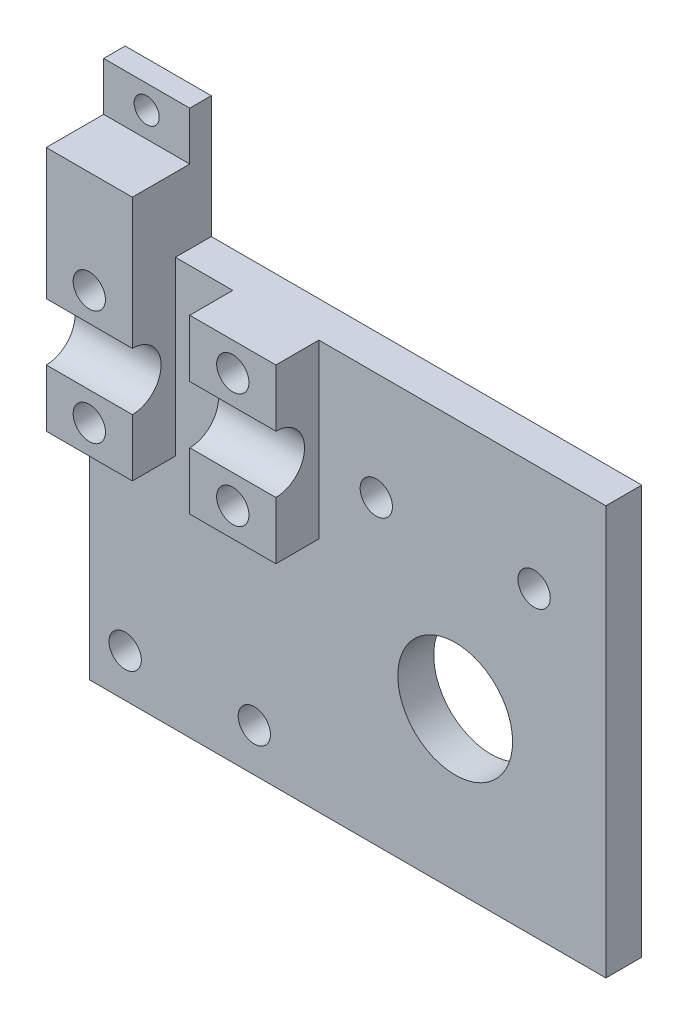
ISO-10303-21;
HEADER;
FILE_DESCRIPTION(('STEP AP214'),'2;1');
FILE_NAME('part.step','',(''),(''),'','','');
FILE_SCHEMA(('AUTOMOTIVE_DESIGN { 1 0 10303 214 1 1 1 1 }'));
ENDSEC;
DATA;
#1=APPLICATION_CONTEXT('core data for automotive mechanical design processes');
#2=APPLICATION_PROTOCOL_DEFINITION('international standard','automotive_design',2000,#1);
#3=PRODUCT_CONTEXT('',#1,'mechanical');
#4=PRODUCT('Part','Part','',(#3));
#5=PRODUCT_RELATED_PRODUCT_CATEGORY('part','',(#4));
#6=PRODUCT_DEFINITION_FORMATION('','',#4);
#7=PRODUCT_DEFINITION_CONTEXT('part definition',#1,'design');
#8=PRODUCT_DEFINITION('design','',#6,#7);
#9=PRODUCT_DEFINITION_SHAPE('','',#8);
#10=(LENGTH_UNIT() NAMED_UNIT(*) SI_UNIT(.MILLI.,.METRE.));
#11=(NAMED_UNIT(*) PLANE_ANGLE_UNIT() SI_UNIT($,.RADIAN.));
#12=(NAMED_UNIT(*) SI_UNIT($,.STERADIAN.) SOLID_ANGLE_UNIT());
#13=UNCERTAINTY_MEASURE_WITH_UNIT(LENGTH_MEASURE(1.E-05),#10,'distance_accuracy_value','');
#14=(GEOMETRIC_REPRESENTATION_CONTEXT(3) GLOBAL_UNCERTAINTY_ASSIGNED_CONTEXT((#13)) GLOBAL_UNIT_ASSIGNED_CONTEXT((#10,
#11,#12)) REPRESENTATION_CONTEXT('',''));
#15=CARTESIAN_POINT('',(0.,0.,0.));
#16=DIRECTION('',(0.,0.,1.));
#17=DIRECTION('',(1.,0.,0.));
#18=AXIS2_PLACEMENT_3D('',#15,#16,#17);
#19=CARTESIAN_POINT('',(-16.,28.5,5.));
#20=DIRECTION('',(0.,-1.,0.));
#21=DIRECTION('',(1.,0.,0.));
#22=AXIS2_PLACEMENT_3D('',#19,#20,#21);
#23=PLANE('',#22);
#24=DIRECTION('',(0.,0.,-1.));
#25=VECTOR('',#24,1.);
#26=CARTESIAN_POINT('',(-4.,28.5,3.));
#27=LINE('',#26,#25);
#28=CARTESIAN_POINT('',(-4.,28.5,5.));
#29=VERTEX_POINT('',#28);
#30=CARTESIAN_POINT('',(-4.,28.5,0.));
#31=VERTEX_POINT('',#30);
#32=EDGE_CURVE('E204',#29,#31,#27,.T.);
#33=ORIENTED_EDGE('',*,*,#32,.F.);
#34=DIRECTION('',(-1.,0.,0.));
#35=VECTOR('',#34,1.);
#36=CARTESIAN_POINT('',(-16.,28.5,5.));
#37=LINE('',#36,#35);
#38=CARTESIAN_POINT('',(4.,28.5,5.));
#39=VERTEX_POINT('',#38);
#40=EDGE_CURVE('E335',#39,#29,#37,.T.);
#41=ORIENTED_EDGE('',*,*,#40,.F.);
#42=DIRECTION('',(0.,0.,1.));
#43=VECTOR('',#42,1.);
#44=CARTESIAN_POINT('',(4.,28.5,5.));
#45=LINE('',#44,#43);
#46=CARTESIAN_POINT('',(4.,28.5,11.));
#47=VERTEX_POINT('',#46);
#48=EDGE_CURVE('E265',#39,#47,#45,.T.);
#49=ORIENTED_EDGE('',*,*,#48,.T.);
#50=DIRECTION('',(1.,0.,0.));
#51=VECTOR('',#50,1.);
#52=CARTESIAN_POINT('',(4.,28.5,11.));
#53=LINE('',#52,#51);
#54=CARTESIAN_POINT('',(16.,28.5,11.));
#55=VERTEX_POINT('',#54);
#56=EDGE_CURVE('E268',#47,#55,#53,.T.);
#57=ORIENTED_EDGE('',*,*,#56,.T.);
#58=DIRECTION('',(0.,0.,1.));
#59=VECTOR('',#58,1.);
#60=CARTESIAN_POINT('',(16.,28.5,5.));
#61=LINE('',#60,#59);
#62=CARTESIAN_POINT('',(16.,28.5,5.));
#63=VERTEX_POINT('',#62);
#64=EDGE_CURVE('E253',#63,#55,#61,.T.);
#65=ORIENTED_EDGE('',*,*,#64,.F.);
#66=CARTESIAN_POINT('',(56.,28.5,5.));
#67=VERTEX_POINT('',#66);
#68=EDGE_CURVE('E326',#67,#63,#37,.T.);
#69=ORIENTED_EDGE('',*,*,#68,.F.);
#70=DIRECTION('',(0.,0.,-1.));
#71=VECTOR('',#70,1.);
#72=CARTESIAN_POINT('',(56.,28.5,5.));
#73=LINE('',#72,#71);
#74=CARTESIAN_POINT('',(56.,28.5,0.));
#75=VERTEX_POINT('',#74);
#76=EDGE_CURVE('E354',#67,#75,#73,.T.);
#77=ORIENTED_EDGE('',*,*,#76,.T.);
#78=DIRECTION('',(-1.,0.,0.));
#79=VECTOR('',#78,1.);
#80=CARTESIAN_POINT('',(-16.,28.5,0.));
#81=LINE('',#80,#79);
#82=EDGE_CURVE('E339',#75,#31,#81,.T.);
#83=ORIENTED_EDGE('',*,*,#82,.T.);
#84=EDGE_LOOP('',(#33,#41,#49,#57,#65,#69,#77,#83));
#85=FACE_BOUND('',#84,.T.);
#86=ADVANCED_FACE('F32',(#85),#23,.F.);
#87=CARTESIAN_POINT('',(0.,0.,3.));
#88=DIRECTION('',(0.,0.,1.));
#89=DIRECTION('',(1.,0.,0.));
#90=AXIS2_PLACEMENT_3D('',#87,#88,#89);
#91=PLANE('',#90);
#92=CARTESIAN_POINT('',(-10.,42.25,3.));
#93=DIRECTION('',(0.,0.,-1.));
#94=DIRECTION('',(-1.,0.,0.));
#95=AXIS2_PLACEMENT_3D('',#92,#93,#94);
#96=CIRCLE('',#95,1.75);
#97=CARTESIAN_POINT('',(-11.75,42.25,3.));
#98=VERTEX_POINT('',#97);
#99=EDGE_CURVE('E187',#98,#98,#96,.T.);
#100=ORIENTED_EDGE('',*,*,#99,.T.);
#101=EDGE_LOOP('',(#100));
#102=FACE_BOUND('',#101,.T.);
#103=DIRECTION('',(0.,1.,0.));
#104=VECTOR('',#103,1.);
#105=CARTESIAN_POINT('',(-16.,39.,3.));
#106=LINE('',#105,#104);
#107=CARTESIAN_POINT('',(-16.,38.75,3.));
#108=VERTEX_POINT('',#107);
#109=CARTESIAN_POINT('',(-16.,45.5,3.));
#110=VERTEX_POINT('',#109);
#111=EDGE_CURVE('E36',#108,#110,#106,.T.);
#112=ORIENTED_EDGE('',*,*,#111,.F.);
#113=DIRECTION('',(-1.,0.,0.));
#114=VECTOR('',#113,1.);
#115=CARTESIAN_POINT('',(-16.,38.75,3.));
#116=LINE('',#115,#114);
#117=CARTESIAN_POINT('',(-4.,38.75,3.));
#118=VERTEX_POINT('',#117);
#119=EDGE_CURVE('E182',#118,#108,#116,.T.);
#120=ORIENTED_EDGE('',*,*,#119,.F.);
#121=DIRECTION('',(0.,-1.,0.));
#122=VECTOR('',#121,1.);
#123=CARTESIAN_POINT('',(-4.,39.,3.));
#124=LINE('',#123,#122);
#125=CARTESIAN_POINT('',(-4.,45.5,3.));
#126=VERTEX_POINT('',#125);
#127=EDGE_CURVE('E176',#126,#118,#124,.T.);
#128=ORIENTED_EDGE('',*,*,#127,.F.);
#129=DIRECTION('',(1.,0.,0.));
#130=VECTOR('',#129,1.);
#131=CARTESIAN_POINT('',(-16.,45.5,3.));
#132=LINE('',#131,#130);
#133=EDGE_CURVE('E193',#110,#126,#132,.T.);
#134=ORIENTED_EDGE('',*,*,#133,.F.);
#135=EDGE_LOOP('',(#112,#120,#128,#134));
#136=FACE_BOUND('',#135,.T.);
#137=ADVANCED_FACE('F418',(#102,#136),#91,.T.);
#138=CARTESIAN_POINT('',(0.,0.,0.));
#139=DIRECTION('',(0.,0.,1.));
#140=DIRECTION('',(1.,0.,0.));
#141=AXIS2_PLACEMENT_3D('',#138,#139,#140);
#142=PLANE('',#141);
#143=CARTESIAN_POINT('',(24.,13.5,0.));
#144=DIRECTION('',(0.,0.,1.));
#145=DIRECTION('',(1.,0.,0.));
#146=AXIS2_PLACEMENT_3D('',#143,#144,#145);
#147=CIRCLE('',#146,2.25);
#148=CARTESIAN_POINT('',(26.25,13.5,0.));
#149=VERTEX_POINT('',#148);
#150=EDGE_CURVE('E207',#149,#149,#147,.T.);
#151=ORIENTED_EDGE('',*,*,#150,.T.);
#152=EDGE_LOOP('',(#151));
#153=FACE_BOUND('',#152,.T.);
#154=CARTESIAN_POINT('',(46.,13.5,0.));
#155=DIRECTION('',(0.,0.,1.));
#156=DIRECTION('',(1.,0.,0.));
#157=AXIS2_PLACEMENT_3D('',#154,#155,#156);
#158=CIRCLE('',#157,2.25);
#159=CARTESIAN_POINT('',(48.25,13.5,0.));
#160=VERTEX_POINT('',#159);
#161=EDGE_CURVE('E214',#160,#160,#158,.T.);
#162=ORIENTED_EDGE('',*,*,#161,.T.);
#163=EDGE_LOOP('',(#162));
#164=FACE_BOUND('',#163,.T.);
#165=CARTESIAN_POINT('',(7.00000000000001,-22.5,0.));
#166=DIRECTION('',(0.,0.,1.));
#167=DIRECTION('',(1.,0.,0.));
#168=AXIS2_PLACEMENT_3D('',#165,#166,#167);
#169=CIRCLE('',#168,2.25000000000001);
#170=CARTESIAN_POINT('',(9.25000000000002,-22.5,0.));
#171=VERTEX_POINT('',#170);
#172=EDGE_CURVE('E220',#171,#171,#169,.T.);
#173=ORIENTED_EDGE('',*,*,#172,.T.);
#174=EDGE_LOOP('',(#173));
#175=FACE_BOUND('',#174,.T.);
#176=CARTESIAN_POINT('',(-11.,-22.5,0.));
#177=DIRECTION('',(0.,0.,1.));
#178=DIRECTION('',(1.,0.,0.));
#179=AXIS2_PLACEMENT_3D('',#176,#177,#178);
#180=CIRCLE('',#179,2.25);
#181=CARTESIAN_POINT('',(-8.74999999999999,-22.5,0.));
#182=VERTEX_POINT('',#181);
#183=EDGE_CURVE('E226',#182,#182,#180,.T.);
#184=ORIENTED_EDGE('',*,*,#183,.T.);
#185=EDGE_LOOP('',(#184));
#186=FACE_BOUND('',#185,.T.);
#187=CARTESIAN_POINT('',(35.,-6.50000000000001,0.));
#188=DIRECTION('',(0.,0.,1.));
#189=DIRECTION('',(1.,0.,0.));
#190=AXIS2_PLACEMENT_3D('',#187,#188,#189);
#191=CIRCLE('',#190,8.);
#192=CARTESIAN_POINT('',(43.,-6.50000000000001,0.));
#193=VERTEX_POINT('',#192);
#194=EDGE_CURVE('E232',#193,#193,#191,.T.);
#195=ORIENTED_EDGE('',*,*,#194,.T.);
#196=EDGE_LOOP('',(#195));
#197=FACE_BOUND('',#196,.T.);
#198=CARTESIAN_POINT('',(10.,24.5,0.));
#199=DIRECTION('',(0.,0.,-1.));
#200=DIRECTION('',(-1.,0.,0.));
#201=AXIS2_PLACEMENT_3D('',#198,#199,#200);
#202=CIRCLE('',#201,2.25);
#203=CARTESIAN_POINT('',(7.75000000000001,24.5,0.));
#204=VERTEX_POINT('',#203);
#205=EDGE_CURVE('E244',#204,#204,#202,.T.);
#206=ORIENTED_EDGE('',*,*,#205,.F.);
#207=EDGE_LOOP('',(#206));
#208=FACE_BOUND('',#207,.T.);
#209=CARTESIAN_POINT('',(-10.,8.49999999999999,0.));
#210=DIRECTION('',(0.,0.,1.));
#211=DIRECTION('',(1.,0.,0.));
#212=AXIS2_PLACEMENT_3D('',#209,#210,#211);
#213=CIRCLE('',#212,2.25);
#214=CARTESIAN_POINT('',(-7.75,8.49999999999999,0.));
#215=VERTEX_POINT('',#214);
#216=EDGE_CURVE('E294',#215,#215,#213,.T.);
#217=ORIENTED_EDGE('',*,*,#216,.T.);
#218=EDGE_LOOP('',(#217));
#219=FACE_BOUND('',#218,.T.);
#220=CARTESIAN_POINT('',(-10.,24.5,0.));
#221=DIRECTION('',(0.,0.,1.));
#222=DIRECTION('',(1.,0.,0.));
#223=AXIS2_PLACEMENT_3D('',#220,#221,#222);
#224=CIRCLE('',#223,2.25);
#225=CARTESIAN_POINT('',(-7.75000000000001,24.5,0.));
#226=VERTEX_POINT('',#225);
#227=EDGE_CURVE('E300',#226,#226,#224,.T.);
#228=ORIENTED_EDGE('',*,*,#227,.T.);
#229=EDGE_LOOP('',(#228));
#230=FACE_BOUND('',#229,.T.);
#231=DIRECTION('',(0.,-1.,0.));
#232=VECTOR('',#231,1.);
#233=CARTESIAN_POINT('',(-16.,28.5,0.));
#234=LINE('',#233,#232);
#235=CARTESIAN_POINT('',(-16.,45.5,0.));
#236=VERTEX_POINT('',#235);
#237=CARTESIAN_POINT('',(-16.,-28.5,0.));
#238=VERTEX_POINT('',#237);
#239=EDGE_CURVE('E345',#236,#238,#234,.T.);
#240=ORIENTED_EDGE('',*,*,#239,.F.);
#241=DIRECTION('',(1.,0.,0.));
#242=VECTOR('',#241,1.);
#243=CARTESIAN_POINT('',(-16.,45.5,0.));
#244=LINE('',#243,#242);
#245=CARTESIAN_POINT('',(-4.,45.5,0.));
#246=VERTEX_POINT('',#245);
#247=EDGE_CURVE('E190',#236,#246,#244,.T.);
#248=ORIENTED_EDGE('',*,*,#247,.T.);
#249=DIRECTION('',(0.,-1.,0.));
#250=VECTOR('',#249,1.);
#251=CARTESIAN_POINT('',(-4.,28.5,0.));
#252=LINE('',#251,#250);
#253=EDGE_CURVE('E200',#246,#31,#252,.T.);
#254=ORIENTED_EDGE('',*,*,#253,.T.);
#255=ORIENTED_EDGE('',*,*,#82,.F.);
#256=DIRECTION('',(0.,1.,0.));
#257=VECTOR('',#256,1.);
#258=CARTESIAN_POINT('',(56.,28.5,0.));
#259=LINE('',#258,#257);
#260=CARTESIAN_POINT('',(56.,-28.5,0.));
#261=VERTEX_POINT('',#260);
#262=EDGE_CURVE('E351',#261,#75,#259,.T.);
#263=ORIENTED_EDGE('',*,*,#262,.F.);
#264=DIRECTION('',(1.,0.,0.));
#265=VECTOR('',#264,1.);
#266=CARTESIAN_POINT('',(-16.,-28.5,0.));
#267=LINE('',#266,#265);
#268=EDGE_CURVE('E349',#238,#261,#267,.T.);
#269=ORIENTED_EDGE('',*,*,#268,.F.);
#270=EDGE_LOOP('',(#240,#248,#254,#255,#263,#269));
#271=FACE_BOUND('',#270,.T.);
#272=CARTESIAN_POINT('',(10.,8.49999999999999,0.));
#273=DIRECTION('',(0.,0.,-1.));
#274=DIRECTION('',(-1.,0.,0.));
#275=AXIS2_PLACEMENT_3D('',#272,#273,#274);
#276=CIRCLE('',#275,2.25);
#277=CARTESIAN_POINT('',(7.75,8.49999999999999,0.));
#278=VERTEX_POINT('',#277);
#279=EDGE_CURVE('E238',#278,#278,#276,.T.);
#280=ORIENTED_EDGE('',*,*,#279,.F.);
#281=EDGE_LOOP('',(#280));
#282=FACE_BOUND('',#281,.T.);
#283=CARTESIAN_POINT('',(-10.,42.25,0.));
#284=DIRECTION('',(0.,0.,-1.));
#285=DIRECTION('',(-1.,0.,0.));
#286=AXIS2_PLACEMENT_3D('',#283,#284,#285);
#287=CIRCLE('',#286,1.75);
#288=CARTESIAN_POINT('',(-11.75,42.25,0.));
#289=VERTEX_POINT('',#288);
#290=EDGE_CURVE('E177',#289,#289,#287,.T.);
#291=ORIENTED_EDGE('',*,*,#290,.F.);
#292=EDGE_LOOP('',(#291));
#293=FACE_BOUND('',#292,.T.);
#294=ADVANCED_FACE('F423',(#153,#164,#175,#186,#197,#208,#219,#230,#271,#282,#293),#142,.F.);
#295=CARTESIAN_POINT('',(4.,12.5,11.));
#296=DIRECTION('',(0.,0.,1.));
#297=DIRECTION('',(0.,-1.,0.));
#298=AXIS2_PLACEMENT_3D('',#295,#296,#297);
#299=PLANE('',#298);
#300=DIRECTION('',(0.,-1.,0.));
#301=VECTOR('',#300,1.);
#302=CARTESIAN_POINT('',(16.,12.5,11.));
#303=LINE('',#302,#301);
#304=CARTESIAN_POINT('',(16.,12.5,11.));
#305=VERTEX_POINT('',#304);
#306=CARTESIAN_POINT('',(16.,4.49999999999999,11.));
#307=VERTEX_POINT('',#306);
#308=EDGE_CURVE('E274',#305,#307,#303,.T.);
#309=ORIENTED_EDGE('',*,*,#308,.F.);
#310=DIRECTION('',(1.,0.,0.));
#311=VECTOR('',#310,1.);
#312=CARTESIAN_POINT('',(4.,12.5,11.));
#313=LINE('',#312,#311);
#314=CARTESIAN_POINT('',(4.,12.5,11.));
#315=VERTEX_POINT('',#314);
#316=EDGE_CURVE('E288',#315,#305,#313,.T.);
#317=ORIENTED_EDGE('',*,*,#316,.F.);
#318=DIRECTION('',(0.,-1.,0.));
#319=VECTOR('',#318,1.);
#320=CARTESIAN_POINT('',(4.,12.5,11.));
#321=LINE('',#320,#319);
#322=CARTESIAN_POINT('',(4.,4.49999999999999,11.));
#323=VERTEX_POINT('',#322);
#324=EDGE_CURVE('E256',#315,#323,#321,.T.);
#325=ORIENTED_EDGE('',*,*,#324,.T.);
#326=DIRECTION('',(1.,0.,0.));
#327=VECTOR('',#326,1.);
#328=CARTESIAN_POINT('',(4.,4.49999999999999,11.));
#329=LINE('',#328,#327);
#330=EDGE_CURVE('E290',#323,#307,#329,.T.);
#331=ORIENTED_EDGE('',*,*,#330,.T.);
#332=EDGE_LOOP('',(#309,#317,#325,#331));
#333=FACE_BOUND('',#332,.T.);
#334=CARTESIAN_POINT('',(10.,8.49999999999999,11.));
#335=DIRECTION('',(0.,0.,-1.));
#336=DIRECTION('',(-1.,0.,0.));
#337=AXIS2_PLACEMENT_3D('',#334,#335,#336);
#338=CIRCLE('',#337,2.25);
#339=CARTESIAN_POINT('',(7.75,8.49999999999999,11.));
#340=VERTEX_POINT('',#339);
#341=EDGE_CURVE('E235',#340,#340,#338,.T.);
#342=ORIENTED_EDGE('',*,*,#341,.T.);
#343=EDGE_LOOP('',(#342));
#344=FACE_BOUND('',#343,.T.);
#345=ADVANCED_FACE('F390',(#333,#344),#299,.T.);
#346=CARTESIAN_POINT('',(4.,28.5,11.));
#347=DIRECTION('',(0.,0.,1.));
#348=DIRECTION('',(1.,0.,0.));
#349=AXIS2_PLACEMENT_3D('',#346,#347,#348);
#350=PLANE('',#349);
#351=DIRECTION('',(0.,-1.,0.));
#352=VECTOR('',#351,1.);
#353=CARTESIAN_POINT('',(16.,28.5,11.));
#354=LINE('',#353,#352);
#355=CARTESIAN_POINT('',(16.,20.5,11.));
#356=VERTEX_POINT('',#355);
#357=EDGE_CURVE('E280',#55,#356,#354,.T.);
#358=ORIENTED_EDGE('',*,*,#357,.F.);
#359=ORIENTED_EDGE('',*,*,#56,.F.);
#360=DIRECTION('',(0.,-1.,0.));
#361=VECTOR('',#360,1.);
#362=CARTESIAN_POINT('',(4.,28.5,11.));
#363=LINE('',#362,#361);
#364=CARTESIAN_POINT('',(4.,20.5,11.));
#365=VERTEX_POINT('',#364);
#366=EDGE_CURVE('E262',#47,#365,#363,.T.);
#367=ORIENTED_EDGE('',*,*,#366,.T.);
#368=DIRECTION('',(1.,0.,0.));
#369=VECTOR('',#368,1.);
#370=CARTESIAN_POINT('',(4.,20.5,11.));
#371=LINE('',#370,#369);
#372=EDGE_CURVE('E286',#365,#356,#371,.T.);
#373=ORIENTED_EDGE('',*,*,#372,.T.);
#374=EDGE_LOOP('',(#358,#359,#367,#373));
#375=FACE_BOUND('',#374,.T.);
#376=CARTESIAN_POINT('',(10.,24.5,11.));
#377=DIRECTION('',(0.,0.,-1.));
#378=DIRECTION('',(-1.,0.,0.));
#379=AXIS2_PLACEMENT_3D('',#376,#377,#378);
#380=CIRCLE('',#379,2.25);
#381=CARTESIAN_POINT('',(7.75000000000001,24.5,11.));
#382=VERTEX_POINT('',#381);
#383=EDGE_CURVE('E241',#382,#382,#380,.T.);
#384=ORIENTED_EDGE('',*,*,#383,.T.);
#385=EDGE_LOOP('',(#384));
#386=FACE_BOUND('',#385,.T.);
#387=ADVANCED_FACE('F397',(#375,#386),#350,.T.);
#388=CARTESIAN_POINT('',(0.,0.,5.));
#389=DIRECTION('',(0.,0.,1.));
#390=DIRECTION('',(1.,0.,0.));
#391=AXIS2_PLACEMENT_3D('',#388,#389,#390);
#392=PLANE('',#391);
#393=CARTESIAN_POINT('',(24.,13.5,5.));
#394=DIRECTION('',(0.,0.,1.));
#395=DIRECTION('',(1.,0.,0.));
#396=AXIS2_PLACEMENT_3D('',#393,#394,#395);
#397=CIRCLE('',#396,2.25);
#398=CARTESIAN_POINT('',(26.25,13.5,5.));
#399=VERTEX_POINT('',#398);
#400=EDGE_CURVE('E211',#399,#399,#397,.T.);
#401=ORIENTED_EDGE('',*,*,#400,.F.);
#402=EDGE_LOOP('',(#401));
#403=FACE_BOUND('',#402,.T.);
#404=CARTESIAN_POINT('',(46.,13.5,5.));
#405=DIRECTION('',(0.,0.,1.));
#406=DIRECTION('',(1.,0.,0.));
#407=AXIS2_PLACEMENT_3D('',#404,#405,#406);
#408=CIRCLE('',#407,2.25);
#409=CARTESIAN_POINT('',(48.25,13.5,5.));
#410=VERTEX_POINT('',#409);
#411=EDGE_CURVE('E210',#410,#410,#408,.T.);
#412=ORIENTED_EDGE('',*,*,#411,.F.);
#413=EDGE_LOOP('',(#412));
#414=FACE_BOUND('',#413,.T.);
#415=CARTESIAN_POINT('',(7.00000000000001,-22.5,5.));
#416=DIRECTION('',(0.,0.,1.));
#417=DIRECTION('',(1.,0.,0.));
#418=AXIS2_PLACEMENT_3D('',#415,#416,#417);
#419=CIRCLE('',#418,2.25000000000001);
#420=CARTESIAN_POINT('',(9.25000000000002,-22.5,5.));
#421=VERTEX_POINT('',#420);
#422=EDGE_CURVE('E217',#421,#421,#419,.T.);
#423=ORIENTED_EDGE('',*,*,#422,.F.);
#424=EDGE_LOOP('',(#423));
#425=FACE_BOUND('',#424,.T.);
#426=CARTESIAN_POINT('',(-11.,-22.5,5.));
#427=DIRECTION('',(0.,0.,1.));
#428=DIRECTION('',(1.,0.,0.));
#429=AXIS2_PLACEMENT_3D('',#426,#427,#428);
#430=CIRCLE('',#429,2.25);
#431=CARTESIAN_POINT('',(-8.74999999999999,-22.5,5.));
#432=VERTEX_POINT('',#431);
#433=EDGE_CURVE('E223',#432,#432,#430,.T.);
#434=ORIENTED_EDGE('',*,*,#433,.F.);
#435=EDGE_LOOP('',(#434));
#436=FACE_BOUND('',#435,.T.);
#437=CARTESIAN_POINT('',(35.,-6.50000000000001,5.));
#438=DIRECTION('',(0.,0.,1.));
#439=DIRECTION('',(1.,0.,0.));
#440=AXIS2_PLACEMENT_3D('',#437,#438,#439);
#441=CIRCLE('',#440,8.);
#442=CARTESIAN_POINT('',(43.,-6.50000000000001,5.));
#443=VERTEX_POINT('',#442);
#444=EDGE_CURVE('E229',#443,#443,#441,.T.);
#445=ORIENTED_EDGE('',*,*,#444,.F.);
#446=EDGE_LOOP('',(#445));
#447=FACE_BOUND('',#446,.T.);
#448=DIRECTION('',(1.,0.,0.));
#449=VECTOR('',#448,1.);
#450=CARTESIAN_POINT('',(4.,4.49999999999999,5.));
#451=LINE('',#450,#449);
#452=CARTESIAN_POINT('',(4.,4.49999999999999,5.));
#453=VERTEX_POINT('',#452);
#454=CARTESIAN_POINT('',(16.,4.49999999999999,5.));
#455=VERTEX_POINT('',#454);
#456=EDGE_CURVE('E58',#453,#455,#451,.T.);
#457=ORIENTED_EDGE('',*,*,#456,.F.);
#458=DIRECTION('',(0.,1.,0.));
#459=VECTOR('',#458,1.);
#460=CARTESIAN_POINT('',(4.,4.49999999999999,5.));
#461=LINE('',#460,#459);
#462=EDGE_CURVE('E250',#453,#39,#461,.T.);
#463=ORIENTED_EDGE('',*,*,#462,.T.);
#464=ORIENTED_EDGE('',*,*,#40,.T.);
#465=DIRECTION('',(0.,1.,0.));
#466=VECTOR('',#465,1.);
#467=CARTESIAN_POINT('',(-4.,4.49999999999999,5.));
#468=LINE('',#467,#466);
#469=CARTESIAN_POINT('',(-4.,4.49999999999999,5.));
#470=VERTEX_POINT('',#469);
#471=EDGE_CURVE('E170',#470,#29,#468,.T.);
#472=ORIENTED_EDGE('',*,*,#471,.F.);
#473=DIRECTION('',(-1.,0.,0.));
#474=VECTOR('',#473,1.);
#475=CARTESIAN_POINT('',(-4.,4.49999999999999,5.));
#476=LINE('',#475,#474);
#477=CARTESIAN_POINT('',(-16.,4.5,5.));
#478=VERTEX_POINT('',#477);
#479=EDGE_CURVE('E311',#470,#478,#476,.T.);
#480=ORIENTED_EDGE('',*,*,#479,.T.);
#481=DIRECTION('',(0.,-1.,0.));
#482=VECTOR('',#481,1.);
#483=CARTESIAN_POINT('',(-16.,28.5,5.));
#484=LINE('',#483,#482);
#485=CARTESIAN_POINT('',(-16.,-28.5,5.));
#486=VERTEX_POINT('',#485);
#487=EDGE_CURVE('E358',#478,#486,#484,.T.);
#488=ORIENTED_EDGE('',*,*,#487,.T.);
#489=DIRECTION('',(1.,0.,0.));
#490=VECTOR('',#489,1.);
#491=CARTESIAN_POINT('',(-16.,-28.5,5.));
#492=LINE('',#491,#490);
#493=CARTESIAN_POINT('',(56.,-28.5,5.));
#494=VERTEX_POINT('',#493);
#495=EDGE_CURVE('E360',#486,#494,#492,.T.);
#496=ORIENTED_EDGE('',*,*,#495,.T.);
#497=DIRECTION('',(0.,1.,0.));
#498=VECTOR('',#497,1.);
#499=CARTESIAN_POINT('',(56.,28.5,5.));
#500=LINE('',#499,#498);
#501=EDGE_CURVE('E338',#494,#67,#500,.T.);
#502=ORIENTED_EDGE('',*,*,#501,.T.);
#503=ORIENTED_EDGE('',*,*,#68,.T.);
#504=DIRECTION('',(0.,1.,0.));
#505=VECTOR('',#504,1.);
#506=CARTESIAN_POINT('',(16.,4.49999999999999,5.));
#507=LINE('',#506,#505);
#508=EDGE_CURVE('E247',#455,#63,#507,.T.);
#509=ORIENTED_EDGE('',*,*,#508,.F.);
#510=EDGE_LOOP('',(#457,#463,#464,#472,#480,#488,#496,#502,#503,#509));
#511=FACE_BOUND('',#510,.T.);
#512=ADVANCED_FACE('F367',(#403,#414,#425,#436,#447,#511),#392,.T.);
#513=CARTESIAN_POINT('',(-16.,28.5,5.));
#514=DIRECTION('',(1.,0.,0.));
#515=DIRECTION('',(0.,1.,0.));
#516=AXIS2_PLACEMENT_3D('',#513,#514,#515);
#517=PLANE('',#516);
#518=ORIENTED_EDGE('',*,*,#239,.T.);
#519=DIRECTION('',(0.,0.,-1.));
#520=VECTOR('',#519,1.);
#521=CARTESIAN_POINT('',(-16.,-28.5,5.));
#522=LINE('',#521,#520);
#523=EDGE_CURVE('E11',#486,#238,#522,.T.);
#524=ORIENTED_EDGE('',*,*,#523,.F.);
#525=ORIENTED_EDGE('',*,*,#487,.F.);
#526=DIRECTION('',(0.,0.,-1.));
#527=VECTOR('',#526,1.);
#528=CARTESIAN_POINT('',(-16.,4.49999999999999,11.));
#529=LINE('',#528,#527);
#530=CARTESIAN_POINT('',(-16.,4.49999999999999,11.));
#531=VERTEX_POINT('',#530);
#532=EDGE_CURVE('E317',#531,#478,#529,.T.);
#533=ORIENTED_EDGE('',*,*,#532,.F.);
#534=DIRECTION('',(0.,-1.,0.));
#535=VECTOR('',#534,1.);
#536=CARTESIAN_POINT('',(-16.,12.5,11.));
#537=LINE('',#536,#535);
#538=CARTESIAN_POINT('',(-16.,12.5,11.));
#539=VERTEX_POINT('',#538);
#540=EDGE_CURVE('E315',#539,#531,#537,.T.);
#541=ORIENTED_EDGE('',*,*,#540,.F.);
#542=CARTESIAN_POINT('',(-16.,16.5,11.));
#543=DIRECTION('',(-1.,0.,0.));
#544=DIRECTION('',(0.,-1.,0.));
#545=AXIS2_PLACEMENT_3D('',#542,#543,#544);
#546=CIRCLE('',#545,4.);
#547=CARTESIAN_POINT('',(-16.,20.5,11.));
#548=VERTEX_POINT('',#547);
#549=EDGE_CURVE('E313',#548,#539,#546,.T.);
#550=ORIENTED_EDGE('',*,*,#549,.F.);
#551=DIRECTION('',(0.,-1.,0.));
#552=VECTOR('',#551,1.);
#553=CARTESIAN_POINT('',(-16.,28.5,11.));
#554=LINE('',#553,#552);
#555=CARTESIAN_POINT('',(-16.,38.75,11.));
#556=VERTEX_POINT('',#555);
#557=EDGE_CURVE('E303',#556,#548,#554,.T.);
#558=ORIENTED_EDGE('',*,*,#557,.F.);
#559=DIRECTION('',(0.,0.,-1.));
#560=VECTOR('',#559,1.);
#561=CARTESIAN_POINT('',(-16.,38.75,11.));
#562=LINE('',#561,#560);
#563=EDGE_CURVE('E178',#556,#108,#562,.T.);
#564=ORIENTED_EDGE('',*,*,#563,.T.);
#565=ORIENTED_EDGE('',*,*,#111,.T.);
#566=DIRECTION('',(0.,0.,-1.));
#567=VECTOR('',#566,1.);
#568=CARTESIAN_POINT('',(-16.,45.5,3.));
#569=LINE('',#568,#567);
#570=EDGE_CURVE('E197',#110,#236,#569,.T.);
#571=ORIENTED_EDGE('',*,*,#570,.T.);
#572=EDGE_LOOP('',(#518,#524,#525,#533,#541,#550,#558,#564,#565,#571));
#573=FACE_BOUND('',#572,.T.);
#574=ADVANCED_FACE('F34',(#573),#517,.F.);
#575=CARTESIAN_POINT('',(-16.,-28.5,5.));
#576=DIRECTION('',(0.,1.,0.));
#577=DIRECTION('',(0.,0.,1.));
#578=AXIS2_PLACEMENT_3D('',#575,#576,#577);
#579=PLANE('',#578);
#580=ORIENTED_EDGE('',*,*,#268,.T.);
#581=DIRECTION('',(0.,0.,-1.));
#582=VECTOR('',#581,1.);
#583=CARTESIAN_POINT('',(56.,-28.5,5.));
#584=LINE('',#583,#582);
#585=EDGE_CURVE('E42',#494,#261,#584,.T.);
#586=ORIENTED_EDGE('',*,*,#585,.F.);
#587=ORIENTED_EDGE('',*,*,#495,.F.);
#588=ORIENTED_EDGE('',*,*,#523,.T.);
#589=EDGE_LOOP('',(#580,#586,#587,#588));
#590=FACE_BOUND('',#589,.T.);
#591=ADVANCED_FACE('F430',(#590),#579,.F.);
#592=CARTESIAN_POINT('',(56.,28.5,5.));
#593=DIRECTION('',(-1.,0.,0.));
#594=DIRECTION('',(0.,-1.,0.));
#595=AXIS2_PLACEMENT_3D('',#592,#593,#594);
#596=PLANE('',#595);
#597=ORIENTED_EDGE('',*,*,#262,.T.);
#598=ORIENTED_EDGE('',*,*,#76,.F.);
#599=ORIENTED_EDGE('',*,*,#501,.F.);
#600=ORIENTED_EDGE('',*,*,#585,.T.);
#601=EDGE_LOOP('',(#597,#598,#599,#600));
#602=FACE_BOUND('',#601,.T.);
#603=ADVANCED_FACE('F370',(#602),#596,.F.);
#604=CARTESIAN_POINT('',(-4.,28.5,11.));
#605=DIRECTION('',(0.,0.,-1.));
#606=DIRECTION('',(-1.,0.,0.));
#607=AXIS2_PLACEMENT_3D('',#604,#605,#606);
#608=PLANE('',#607);
#609=CARTESIAN_POINT('',(-10.,24.5,11.));
#610=DIRECTION('',(0.,0.,1.));
#611=DIRECTION('',(1.,0.,0.));
#612=AXIS2_PLACEMENT_3D('',#609,#610,#611);
#613=CIRCLE('',#612,2.25);
#614=CARTESIAN_POINT('',(-7.75000000000001,24.5,11.));
#615=VERTEX_POINT('',#614);
#616=EDGE_CURVE('E297',#615,#615,#613,.T.);
#617=ORIENTED_EDGE('',*,*,#616,.F.);
#618=EDGE_LOOP('',(#617));
#619=FACE_BOUND('',#618,.T.);
#620=ORIENTED_EDGE('',*,*,#557,.T.);
#621=DIRECTION('',(-1.,0.,0.));
#622=VECTOR('',#621,1.);
#623=CARTESIAN_POINT('',(-4.,20.5,11.));
#624=LINE('',#623,#622);
#625=CARTESIAN_POINT('',(-4.,20.5,11.));
#626=VERTEX_POINT('',#625);
#627=EDGE_CURVE('E166',#626,#548,#624,.T.);
#628=ORIENTED_EDGE('',*,*,#627,.F.);
#629=DIRECTION('',(0.,-1.,0.));
#630=VECTOR('',#629,1.);
#631=CARTESIAN_POINT('',(-4.,28.5,11.));
#632=LINE('',#631,#630);
#633=CARTESIAN_POINT('',(-4.00000000000001,38.75,11.));
#634=VERTEX_POINT('',#633);
#635=EDGE_CURVE('E161',#634,#626,#632,.T.);
#636=ORIENTED_EDGE('',*,*,#635,.F.);
#637=DIRECTION('',(-1.,0.,0.));
#638=VECTOR('',#637,1.);
#639=CARTESIAN_POINT('',(-16.,38.75,11.));
#640=LINE('',#639,#638);
#641=EDGE_CURVE('E163',#634,#556,#640,.T.);
#642=ORIENTED_EDGE('',*,*,#641,.T.);
#643=EDGE_LOOP('',(#620,#628,#636,#642));
#644=FACE_BOUND('',#643,.T.);
#645=ADVANCED_FACE('F162',(#619,#644),#608,.F.);
#646=CARTESIAN_POINT('',(-4.,16.5,11.));
#647=DIRECTION('',(-1.,0.,0.));
#648=DIRECTION('',(0.,-1.,0.));
#649=AXIS2_PLACEMENT_3D('',#646,#647,#648);
#650=CYLINDRICAL_SURFACE('',#649,4.);
#651=ORIENTED_EDGE('',*,*,#549,.T.);
#652=DIRECTION('',(-1.,0.,0.));
#653=VECTOR('',#652,1.);
#654=CARTESIAN_POINT('',(-4.,12.5,11.));
#655=LINE('',#654,#653);
#656=CARTESIAN_POINT('',(-4.,12.5,11.));
#657=VERTEX_POINT('',#656);
#658=EDGE_CURVE('E466',#657,#539,#655,.T.);
#659=ORIENTED_EDGE('',*,*,#658,.F.);
#660=CARTESIAN_POINT('',(-4.,16.5,11.));
#661=DIRECTION('',(-1.,0.,0.));
#662=DIRECTION('',(0.,-1.,0.));
#663=AXIS2_PLACEMENT_3D('',#660,#661,#662);
#664=CIRCLE('',#663,4.);
#665=EDGE_CURVE('E169',#626,#657,#664,.T.);
#666=ORIENTED_EDGE('',*,*,#665,.F.);
#667=ORIENTED_EDGE('',*,*,#627,.T.);
#668=EDGE_LOOP('',(#651,#659,#666,#667));
#669=FACE_BOUND('',#668,.T.);
#670=ADVANCED_FACE('F463',(#669),#650,.F.);
#671=CARTESIAN_POINT('',(-4.,12.5,11.));
#672=DIRECTION('',(0.,0.,-1.));
#673=DIRECTION('',(0.,1.,0.));
#674=AXIS2_PLACEMENT_3D('',#671,#672,#673);
#675=PLANE('',#674);
#676=CARTESIAN_POINT('',(-10.,8.49999999999999,11.));
#677=DIRECTION('',(0.,0.,1.));
#678=DIRECTION('',(1.,0.,0.));
#679=AXIS2_PLACEMENT_3D('',#676,#677,#678);
#680=CIRCLE('',#679,2.25);
#681=CARTESIAN_POINT('',(-7.75,8.49999999999999,11.));
#682=VERTEX_POINT('',#681);
#683=EDGE_CURVE('E293',#682,#682,#680,.T.);
#684=ORIENTED_EDGE('',*,*,#683,.F.);
#685=EDGE_LOOP('',(#684));
#686=FACE_BOUND('',#685,.T.);
#687=ORIENTED_EDGE('',*,*,#540,.T.);
#688=DIRECTION('',(-1.,0.,0.));
#689=VECTOR('',#688,1.);
#690=CARTESIAN_POINT('',(-4.,4.49999999999999,11.));
#691=LINE('',#690,#689);
#692=CARTESIAN_POINT('',(-4.,4.49999999999999,11.));
#693=VERTEX_POINT('',#692);
#694=EDGE_CURVE('E320',#693,#531,#691,.T.);
#695=ORIENTED_EDGE('',*,*,#694,.F.);
#696=DIRECTION('',(0.,-1.,0.));
#697=VECTOR('',#696,1.);
#698=CARTESIAN_POINT('',(-4.,12.5,11.));
#699=LINE('',#698,#697);
#700=EDGE_CURVE('E307',#657,#693,#699,.T.);
#701=ORIENTED_EDGE('',*,*,#700,.F.);
#702=ORIENTED_EDGE('',*,*,#658,.T.);
#703=EDGE_LOOP('',(#687,#695,#701,#702));
#704=FACE_BOUND('',#703,.T.);
#705=ADVANCED_FACE('F468',(#686,#704),#675,.F.);
#706=CARTESIAN_POINT('',(-4.,4.49999999999999,11.));
#707=DIRECTION('',(0.,1.,0.));
#708=DIRECTION('',(0.,0.,1.));
#709=AXIS2_PLACEMENT_3D('',#706,#707,#708);
#710=PLANE('',#709);
#711=ORIENTED_EDGE('',*,*,#532,.T.);
#712=ORIENTED_EDGE('',*,*,#479,.F.);
#713=DIRECTION('',(0.,0.,-1.));
#714=VECTOR('',#713,1.);
#715=CARTESIAN_POINT('',(-4.,4.49999999999999,11.));
#716=LINE('',#715,#714);
#717=EDGE_CURVE('E309',#693,#470,#716,.T.);
#718=ORIENTED_EDGE('',*,*,#717,.F.);
#719=ORIENTED_EDGE('',*,*,#694,.T.);
#720=EDGE_LOOP('',(#711,#712,#718,#719));
#721=FACE_BOUND('',#720,.T.);
#722=ADVANCED_FACE('F450',(#721),#710,.F.);
#723=CARTESIAN_POINT('',(-4.,16.5,11.));
#724=DIRECTION('',(-1.,0.,0.));
#725=DIRECTION('',(0.,-1.,0.));
#726=AXIS2_PLACEMENT_3D('',#723,#724,#725);
#727=PLANE('',#726);
#728=ORIENTED_EDGE('',*,*,#471,.T.);
#729=ORIENTED_EDGE('',*,*,#32,.T.);
#730=ORIENTED_EDGE('',*,*,#253,.F.);
#731=DIRECTION('',(0.,0.,-1.));
#732=VECTOR('',#731,1.);
#733=CARTESIAN_POINT('',(-4.,45.5,3.));
#734=LINE('',#733,#732);
#735=EDGE_CURVE('E201',#126,#246,#734,.T.);
#736=ORIENTED_EDGE('',*,*,#735,.F.);
#737=ORIENTED_EDGE('',*,*,#127,.T.);
#738=DIRECTION('',(0.,0.,-1.));
#739=VECTOR('',#738,1.);
#740=CARTESIAN_POINT('',(-4.00000000000001,38.75,11.));
#741=LINE('',#740,#739);
#742=EDGE_CURVE('E50',#634,#118,#741,.T.);
#743=ORIENTED_EDGE('',*,*,#742,.F.);
#744=ORIENTED_EDGE('',*,*,#635,.T.);
#745=ORIENTED_EDGE('',*,*,#665,.T.);
#746=ORIENTED_EDGE('',*,*,#700,.T.);
#747=ORIENTED_EDGE('',*,*,#717,.T.);
#748=EDGE_LOOP('',(#728,#729,#730,#736,#737,#743,#744,#745,#746,#747));
#749=FACE_BOUND('',#748,.T.);
#750=ADVANCED_FACE('F174',(#749),#727,.F.);
#751=CARTESIAN_POINT('',(-10.,24.5,0.));
#752=DIRECTION('',(0.,0.,1.));
#753=DIRECTION('',(1.,0.,0.));
#754=AXIS2_PLACEMENT_3D('',#751,#752,#753);
#755=CYLINDRICAL_SURFACE('',#754,2.25);
#756=ORIENTED_EDGE('',*,*,#227,.F.);
#757=EDGE_LOOP('',(#756));
#758=FACE_BOUND('',#757,.T.);
#759=ORIENTED_EDGE('',*,*,#616,.T.);
#760=EDGE_LOOP('',(#759));
#761=FACE_BOUND('',#760,.T.);
#762=ADVANCED_FACE('F625',(#758,#761),#755,.F.);
#763=CARTESIAN_POINT('',(-10.,8.49999999999999,0.));
#764=DIRECTION('',(0.,0.,1.));
#765=DIRECTION('',(1.,0.,0.));
#766=AXIS2_PLACEMENT_3D('',#763,#764,#765);
#767=CYLINDRICAL_SURFACE('',#766,2.25);
#768=ORIENTED_EDGE('',*,*,#216,.F.);
#769=EDGE_LOOP('',(#768));
#770=FACE_BOUND('',#769,.T.);
#771=ORIENTED_EDGE('',*,*,#683,.T.);
#772=EDGE_LOOP('',(#771));
#773=FACE_BOUND('',#772,.T.);
#774=ADVANCED_FACE('F601',(#770,#773),#767,.F.);
#775=CARTESIAN_POINT('',(4.,4.49999999999999,11.));
#776=DIRECTION('',(0.,-1.,0.));
#777=DIRECTION('',(0.,0.,-1.));
#778=AXIS2_PLACEMENT_3D('',#775,#776,#777);
#779=PLANE('',#778);
#780=DIRECTION('',(0.,0.,-1.));
#781=VECTOR('',#780,1.);
#782=CARTESIAN_POINT('',(16.,4.49999999999999,11.));
#783=LINE('',#782,#781);
#784=EDGE_CURVE('E271',#307,#455,#783,.T.);
#785=ORIENTED_EDGE('',*,*,#784,.F.);
#786=ORIENTED_EDGE('',*,*,#330,.F.);
#787=DIRECTION('',(0.,0.,-1.));
#788=VECTOR('',#787,1.);
#789=CARTESIAN_POINT('',(4.,4.49999999999999,11.));
#790=LINE('',#789,#788);
#791=EDGE_CURVE('E252',#323,#453,#790,.T.);
#792=ORIENTED_EDGE('',*,*,#791,.T.);
#793=ORIENTED_EDGE('',*,*,#456,.T.);
#794=EDGE_LOOP('',(#785,#786,#792,#793));
#795=FACE_BOUND('',#794,.T.);
#796=ADVANCED_FACE('F381',(#795),#779,.T.);
#797=CARTESIAN_POINT('',(4.,16.5,11.));
#798=DIRECTION('',(1.,0.,0.));
#799=DIRECTION('',(0.,1.,0.));
#800=AXIS2_PLACEMENT_3D('',#797,#798,#799);
#801=CYLINDRICAL_SURFACE('',#800,4.);
#802=CARTESIAN_POINT('',(16.,16.5,11.));
#803=DIRECTION('',(-1.,0.,0.));
#804=DIRECTION('',(0.,-1.,0.));
#805=AXIS2_PLACEMENT_3D('',#802,#803,#804);
#806=CIRCLE('',#805,4.);
#807=EDGE_CURVE('E277',#356,#305,#806,.T.);
#808=ORIENTED_EDGE('',*,*,#807,.F.);
#809=ORIENTED_EDGE('',*,*,#372,.F.);
#810=CARTESIAN_POINT('',(4.,16.5,11.));
#811=DIRECTION('',(-1.,0.,0.));
#812=DIRECTION('',(0.,-1.,0.));
#813=AXIS2_PLACEMENT_3D('',#810,#811,#812);
#814=CIRCLE('',#813,4.);
#815=EDGE_CURVE('E259',#365,#315,#814,.T.);
#816=ORIENTED_EDGE('',*,*,#815,.T.);
#817=ORIENTED_EDGE('',*,*,#316,.T.);
#818=EDGE_LOOP('',(#808,#809,#816,#817));
#819=FACE_BOUND('',#818,.T.);
#820=ADVANCED_FACE('F394',(#819),#801,.F.);
#821=CARTESIAN_POINT('',(4.,16.5,11.));
#822=DIRECTION('',(1.,0.,0.));
#823=DIRECTION('',(0.,-1.,0.));
#824=AXIS2_PLACEMENT_3D('',#821,#822,#823);
#825=PLANE('',#824);
#826=ORIENTED_EDGE('',*,*,#462,.F.);
#827=ORIENTED_EDGE('',*,*,#791,.F.);
#828=ORIENTED_EDGE('',*,*,#324,.F.);
#829=ORIENTED_EDGE('',*,*,#815,.F.);
#830=ORIENTED_EDGE('',*,*,#366,.F.);
#831=ORIENTED_EDGE('',*,*,#48,.F.);
#832=EDGE_LOOP('',(#826,#827,#828,#829,#830,#831));
#833=FACE_BOUND('',#832,.T.);
#834=ADVANCED_FACE('F385',(#833),#825,.F.);
#835=CARTESIAN_POINT('',(16.,16.5,11.));
#836=DIRECTION('',(1.,0.,0.));
#837=DIRECTION('',(0.,-1.,0.));
#838=AXIS2_PLACEMENT_3D('',#835,#836,#837);
#839=PLANE('',#838);
#840=ORIENTED_EDGE('',*,*,#508,.T.);
#841=ORIENTED_EDGE('',*,*,#64,.T.);
#842=ORIENTED_EDGE('',*,*,#357,.T.);
#843=ORIENTED_EDGE('',*,*,#807,.T.);
#844=ORIENTED_EDGE('',*,*,#308,.T.);
#845=ORIENTED_EDGE('',*,*,#784,.T.);
#846=EDGE_LOOP('',(#840,#841,#842,#843,#844,#845));
#847=FACE_BOUND('',#846,.T.);
#848=ADVANCED_FACE('F378',(#847),#839,.T.);
#849=CARTESIAN_POINT('',(10.,24.5,0.));
#850=DIRECTION('',(0.,0.,1.));
#851=DIRECTION('',(1.,0.,0.));
#852=AXIS2_PLACEMENT_3D('',#849,#850,#851);
#853=CYLINDRICAL_SURFACE('',#852,2.25);
#854=ORIENTED_EDGE('',*,*,#205,.T.);
#855=EDGE_LOOP('',(#854));
#856=FACE_BOUND('',#855,.T.);
#857=ORIENTED_EDGE('',*,*,#383,.F.);
#858=EDGE_LOOP('',(#857));
#859=FACE_BOUND('',#858,.T.);
#860=ADVANCED_FACE('F403',(#856,#859),#853,.F.);
#861=CARTESIAN_POINT('',(10.,8.49999999999999,0.));
#862=DIRECTION('',(0.,0.,1.));
#863=DIRECTION('',(1.,0.,0.));
#864=AXIS2_PLACEMENT_3D('',#861,#862,#863);
#865=CYLINDRICAL_SURFACE('',#864,2.25);
#866=ORIENTED_EDGE('',*,*,#279,.T.);
#867=EDGE_LOOP('',(#866));
#868=FACE_BOUND('',#867,.T.);
#869=ORIENTED_EDGE('',*,*,#341,.F.);
#870=EDGE_LOOP('',(#869));
#871=FACE_BOUND('',#870,.T.);
#872=ADVANCED_FACE('F405',(#868,#871),#865,.F.);
#873=CARTESIAN_POINT('',(35.,-6.50000000000001,0.));
#874=DIRECTION('',(0.,0.,1.));
#875=DIRECTION('',(1.,0.,0.));
#876=AXIS2_PLACEMENT_3D('',#873,#874,#875);
#877=CYLINDRICAL_SURFACE('',#876,8.);
#878=ORIENTED_EDGE('',*,*,#194,.F.);
#879=EDGE_LOOP('',(#878));
#880=FACE_BOUND('',#879,.T.);
#881=ORIENTED_EDGE('',*,*,#444,.T.);
#882=EDGE_LOOP('',(#881));
#883=FACE_BOUND('',#882,.T.);
#884=ADVANCED_FACE('F412',(#880,#883),#877,.F.);
#885=CARTESIAN_POINT('',(-11.,-22.5,0.));
#886=DIRECTION('',(0.,0.,1.));
#887=DIRECTION('',(1.,0.,0.));
#888=AXIS2_PLACEMENT_3D('',#885,#886,#887);
#889=CYLINDRICAL_SURFACE('',#888,2.25);
#890=ORIENTED_EDGE('',*,*,#183,.F.);
#891=EDGE_LOOP('',(#890));
#892=FACE_BOUND('',#891,.T.);
#893=ORIENTED_EDGE('',*,*,#433,.T.);
#894=EDGE_LOOP('',(#893));
#895=FACE_BOUND('',#894,.T.);
#896=ADVANCED_FACE('F498',(#892,#895),#889,.F.);
#897=CARTESIAN_POINT('',(7.00000000000001,-22.5,0.));
#898=DIRECTION('',(0.,0.,1.));
#899=DIRECTION('',(1.,0.,0.));
#900=AXIS2_PLACEMENT_3D('',#897,#898,#899);
#901=CYLINDRICAL_SURFACE('',#900,2.25000000000001);
#902=ORIENTED_EDGE('',*,*,#172,.F.);
#903=EDGE_LOOP('',(#902));
#904=FACE_BOUND('',#903,.T.);
#905=ORIENTED_EDGE('',*,*,#422,.T.);
#906=EDGE_LOOP('',(#905));
#907=FACE_BOUND('',#906,.T.);
#908=ADVANCED_FACE('F504',(#904,#907),#901,.F.);
#909=CARTESIAN_POINT('',(46.,13.5,0.));
#910=DIRECTION('',(0.,0.,1.));
#911=DIRECTION('',(1.,0.,0.));
#912=AXIS2_PLACEMENT_3D('',#909,#910,#911);
#913=CYLINDRICAL_SURFACE('',#912,2.25);
#914=ORIENTED_EDGE('',*,*,#161,.F.);
#915=EDGE_LOOP('',(#914));
#916=FACE_BOUND('',#915,.T.);
#917=ORIENTED_EDGE('',*,*,#411,.T.);
#918=EDGE_LOOP('',(#917));
#919=FACE_BOUND('',#918,.T.);
#920=ADVANCED_FACE('F511',(#916,#919),#913,.F.);
#921=CARTESIAN_POINT('',(24.,13.5,0.));
#922=DIRECTION('',(0.,0.,1.));
#923=DIRECTION('',(1.,0.,0.));
#924=AXIS2_PLACEMENT_3D('',#921,#922,#923);
#925=CYLINDRICAL_SURFACE('',#924,2.25);
#926=ORIENTED_EDGE('',*,*,#150,.F.);
#927=EDGE_LOOP('',(#926));
#928=FACE_BOUND('',#927,.T.);
#929=ORIENTED_EDGE('',*,*,#400,.T.);
#930=EDGE_LOOP('',(#929));
#931=FACE_BOUND('',#930,.T.);
#932=ADVANCED_FACE('F515',(#928,#931),#925,.F.);
#933=CARTESIAN_POINT('',(-16.,45.5,3.));
#934=DIRECTION('',(0.,1.,0.));
#935=DIRECTION('',(-1.,0.,0.));
#936=AXIS2_PLACEMENT_3D('',#933,#934,#935);
#937=PLANE('',#936);
#938=ORIENTED_EDGE('',*,*,#247,.F.);
#939=ORIENTED_EDGE('',*,*,#570,.F.);
#940=ORIENTED_EDGE('',*,*,#133,.T.);
#941=ORIENTED_EDGE('',*,*,#735,.T.);
#942=EDGE_LOOP('',(#938,#939,#940,#941));
#943=FACE_BOUND('',#942,.T.);
#944=ADVANCED_FACE('F457',(#943),#937,.T.);
#945=CARTESIAN_POINT('',(-10.,42.25,3.));
#946=DIRECTION('',(0.,0.,-1.));
#947=DIRECTION('',(-1.,0.,0.));
#948=AXIS2_PLACEMENT_3D('',#945,#946,#947);
#949=CYLINDRICAL_SURFACE('',#948,1.75);
#950=ORIENTED_EDGE('',*,*,#99,.F.);
#951=EDGE_LOOP('',(#950));
#952=FACE_BOUND('',#951,.T.);
#953=ORIENTED_EDGE('',*,*,#290,.T.);
#954=EDGE_LOOP('',(#953));
#955=FACE_BOUND('',#954,.T.);
#956=ADVANCED_FACE('F521',(#952,#955),#949,.F.);
#957=CARTESIAN_POINT('',(-16.,38.75,11.));
#958=DIRECTION('',(0.,-1.,0.));
#959=DIRECTION('',(0.,0.,-1.));
#960=AXIS2_PLACEMENT_3D('',#957,#958,#959);
#961=PLANE('',#960);
#962=ORIENTED_EDGE('',*,*,#119,.T.);
#963=ORIENTED_EDGE('',*,*,#563,.F.);
#964=ORIENTED_EDGE('',*,*,#641,.F.);
#965=ORIENTED_EDGE('',*,*,#742,.T.);
#966=EDGE_LOOP('',(#962,#963,#964,#965));
#967=FACE_BOUND('',#966,.T.);
#968=ADVANCED_FACE('F180',(#967),#961,.F.);
#969=CLOSED_SHELL('',(#86,#137,#294,#345,#387,#512,#574,#591,#603,#645,#670,#705,#722,#750,#762,
#774,#796,#820,#834,#848,#860,#872,#884,#896,#908,#920,#932,#944,#956,#968));
#970=MANIFOLD_SOLID_BREP('B2',#969);
#971=ADVANCED_BREP_SHAPE_REPRESENTATION('',(#18,#970),#14);
#972=SHAPE_DEFINITION_REPRESENTATION(#9,#971);
ENDSEC;
END-ISO-10303-21;
